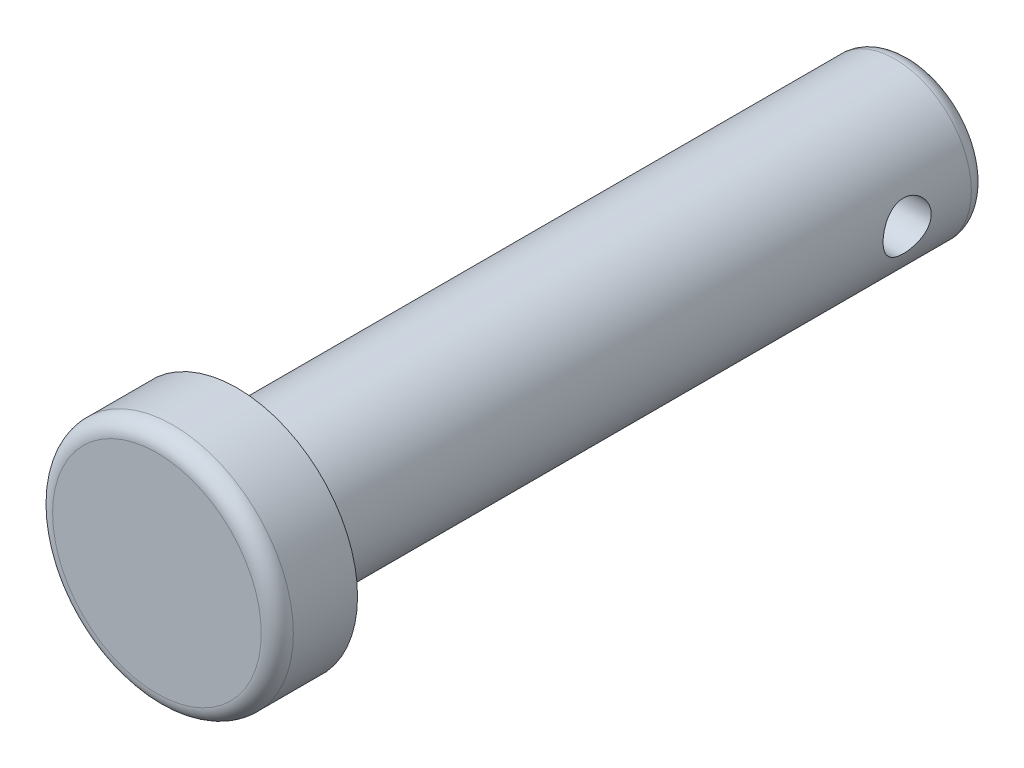
ISO-10303-21;
HEADER;
FILE_DESCRIPTION(('STEP AP214'),'2;1');
FILE_NAME('part.step','',(''),(''),'','','');
FILE_SCHEMA(('AUTOMOTIVE_DESIGN { 1 0 10303 214 1 1 1 1 }'));
ENDSEC;
DATA;
#1=APPLICATION_CONTEXT('core data for automotive mechanical design processes');
#2=APPLICATION_PROTOCOL_DEFINITION('international standard','automotive_design',2000,#1);
#3=PRODUCT_CONTEXT('',#1,'mechanical');
#4=PRODUCT('Part','Part','',(#3));
#5=PRODUCT_RELATED_PRODUCT_CATEGORY('part','',(#4));
#6=PRODUCT_DEFINITION_FORMATION('','',#4);
#7=PRODUCT_DEFINITION_CONTEXT('part definition',#1,'design');
#8=PRODUCT_DEFINITION('design','',#6,#7);
#9=PRODUCT_DEFINITION_SHAPE('','',#8);
#10=(LENGTH_UNIT() NAMED_UNIT(*) SI_UNIT(.MILLI.,.METRE.));
#11=(NAMED_UNIT(*) PLANE_ANGLE_UNIT() SI_UNIT($,.RADIAN.));
#12=(NAMED_UNIT(*) SI_UNIT($,.STERADIAN.) SOLID_ANGLE_UNIT());
#13=UNCERTAINTY_MEASURE_WITH_UNIT(LENGTH_MEASURE(1.E-05),#10,'distance_accuracy_value','');
#14=(GEOMETRIC_REPRESENTATION_CONTEXT(3) GLOBAL_UNCERTAINTY_ASSIGNED_CONTEXT((#13)) GLOBAL_UNIT_ASSIGNED_CONTEXT((#10,
#11,#12)) REPRESENTATION_CONTEXT('',''));
#15=CARTESIAN_POINT('',(0.,0.,0.));
#16=DIRECTION('',(0.,0.,1.));
#17=DIRECTION('',(1.,0.,0.));
#18=AXIS2_PLACEMENT_3D('',#15,#16,#17);
#19=CARTESIAN_POINT('',(0.,0.,0.));
#20=DIRECTION('',(0.,0.,1.));
#21=DIRECTION('',(1.,0.,0.));
#22=AXIS2_PLACEMENT_3D('',#19,#20,#21);
#23=CYLINDRICAL_SURFACE('',#22,4.75);
#24=CARTESIAN_POINT('',(0.,0.,0.));
#25=DIRECTION('',(0.,0.,1.));
#26=DIRECTION('',(1.,0.,0.));
#27=AXIS2_PLACEMENT_3D('',#24,#25,#26);
#28=CIRCLE('',#27,4.75);
#29=CARTESIAN_POINT('',(4.75,0.,0.));
#30=VERTEX_POINT('',#29);
#31=EDGE_CURVE('E70',#30,#30,#28,.T.);
#32=ORIENTED_EDGE('',*,*,#31,.F.);
#33=EDGE_LOOP('',(#32));
#34=FACE_BOUND('',#33,.T.);
#35=CARTESIAN_POINT('',(0.,0.,-41.));
#36=DIRECTION('',(0.,0.,-1.));
#37=DIRECTION('',(-1.,0.,0.));
#38=AXIS2_PLACEMENT_3D('',#35,#36,#37);
#39=CIRCLE('',#38,4.75);
#40=CARTESIAN_POINT('',(-4.75,0.,-41.));
#41=VERTEX_POINT('',#40);
#42=EDGE_CURVE('E55',#41,#41,#39,.F.);
#43=ORIENTED_EDGE('',*,*,#42,.T.);
#44=EDGE_LOOP('',(#43));
#45=FACE_BOUND('',#44,.T.);
#46=CARTESIAN_POINT('',(-4.75,0.,-35.5));
#47=CARTESIAN_POINT('',(-4.74999967904615,-0.0820835447314048,-35.5000004039971));
#48=CARTESIAN_POINT('',(-4.74785228936724,-0.164171496501828,-35.5067598694946));
#49=CARTESIAN_POINT('',(-4.73949648091444,-0.325944116631498,-35.5335464492232));
#50=CARTESIAN_POINT('',(-4.73328722070904,-0.405628283459123,-35.5535763124773));
#51=CARTESIAN_POINT('',(-4.71748543187023,-0.560237269504345,-35.606158956184));
#52=CARTESIAN_POINT('',(-4.7078982073406,-0.635169334090952,-35.638692111107));
#53=CARTESIAN_POINT('',(-4.68632862599565,-0.778514579207217,-35.7152735364287));
#54=CARTESIAN_POINT('',(-4.67434587655187,-0.846926688392997,-35.7593236948384));
#55=CARTESIAN_POINT('',(-4.64883376662147,-0.977443078754503,-35.8591473374264));
#56=CARTESIAN_POINT('',(-4.63527018347254,-1.03931346588883,-35.9152178487368));
#57=CARTESIAN_POINT('',(-4.60832176901776,-1.15294742613926,-36.0368582801228));
#58=CARTESIAN_POINT('',(-4.5949369723419,-1.2047090669501,-36.1024300122094));
#59=CARTESIAN_POINT('',(-4.56949296853185,-1.29793466853577,-36.2432487821159));
#60=CARTESIAN_POINT('',(-4.55747591989588,-1.33910462019172,-36.3186988034441));
#61=CARTESIAN_POINT('',(-4.53664362085522,-1.40807389327236,-36.4758924617762));
#62=CARTESIAN_POINT('',(-4.52782750686213,-1.43587682167781,-36.5576343940453));
#63=CARTESIAN_POINT('',(-4.51475360613692,-1.47646364106285,-36.7224489023695));
#64=CARTESIAN_POINT('',(-4.51036428133252,-1.48968210274354,-36.8054037344088));
#65=CARTESIAN_POINT('',(-4.50625061102434,-1.50208257395981,-36.9724608982199));
#66=CARTESIAN_POINT('',(-4.50652499510326,-1.50126840605207,-37.0565629112566));
#67=CARTESIAN_POINT('',(-4.51159176137022,-1.48596623804714,-37.2199155188389));
#68=CARTESIAN_POINT('',(-4.51620087396631,-1.47203288124122,-37.2992247162408));
#69=CARTESIAN_POINT('',(-4.52911970742075,-1.43178798005592,-37.4543165274426));
#70=CARTESIAN_POINT('',(-4.53742982916609,-1.40547509472982,-37.530098758225));
#71=CARTESIAN_POINT('',(-4.55695325959034,-1.34083084084603,-37.6772972678757));
#72=CARTESIAN_POINT('',(-4.56820783899944,-1.30232683858134,-37.7486320231548));
#73=CARTESIAN_POINT('',(-4.59233341866295,-1.21451321691615,-37.8840088243496));
#74=CARTESIAN_POINT('',(-4.60520484585311,-1.16520074091948,-37.9480489355345));
#75=CARTESIAN_POINT('',(-4.63184688202887,-1.05445721763047,-38.0701513614985));
#76=CARTESIAN_POINT('',(-4.64563145900086,-0.992568961591257,-38.1277967290741));
#77=CARTESIAN_POINT('',(-4.67201892608795,-0.859832533931193,-38.2319932402701));
#78=CARTESIAN_POINT('',(-4.68462172487032,-0.78898367078958,-38.2785435268444));
#79=CARTESIAN_POINT('',(-4.70736283385871,-0.639521244304238,-38.3595190444748));
#80=CARTESIAN_POINT('',(-4.71748034190943,-0.560849403229559,-38.3938429460244));
#81=CARTESIAN_POINT('',(-4.73396063106369,-0.398454273025003,-38.448644777802));
#82=CARTESIAN_POINT('',(-4.74032457733139,-0.314732560358455,-38.4691270049897));
#83=CARTESIAN_POINT('',(-4.74839235389519,-0.14815194200106,-38.4949494591391));
#84=CARTESIAN_POINT('',(-4.75026975398177,-0.0653887879529884,-38.5008539658023));
#85=CARTESIAN_POINT('',(-4.74966735792893,0.099955689480422,-38.4989468825836));
#86=CARTESIAN_POINT('',(-4.74718821327919,0.182537038204384,-38.491137343538));
#87=CARTESIAN_POINT('',(-4.73826543461407,0.342984606452107,-38.4624759101159));
#88=CARTESIAN_POINT('',(-4.73192442641254,0.420917353280696,-38.4419614087206));
#89=CARTESIAN_POINT('',(-4.71602217273613,0.572211571751274,-38.3888856268636));
#90=CARTESIAN_POINT('',(-4.70646052712339,0.645572474036249,-38.3563228494528));
#91=CARTESIAN_POINT('',(-4.68480447515659,0.787656381223488,-38.2791769099363));
#92=CARTESIAN_POINT('',(-4.67265334948307,0.856220098995372,-38.2343167429269));
#93=CARTESIAN_POINT('',(-4.64720609363859,0.985034898254592,-38.1341806788739));
#94=CARTESIAN_POINT('',(-4.63390964727142,1.04528367215737,-38.0789019004592));
#95=CARTESIAN_POINT('',(-4.60699149316922,1.15829337789972,-37.9568434032573));
#96=CARTESIAN_POINT('',(-4.593378435549,1.21065200367447,-37.8896884394285));
#97=CARTESIAN_POINT('',(-4.5679297313532,1.30339506663711,-37.7472499614566));
#98=CARTESIAN_POINT('',(-4.55609406225838,1.34377965554056,-37.6719665503204));
#99=CARTESIAN_POINT('',(-4.53566962908159,1.41118548758715,-37.5155380511194));
#100=CARTESIAN_POINT('',(-4.52706911631109,1.43825519702983,-37.4344154730757));
#101=CARTESIAN_POINT('',(-4.5141696846939,1.47824972090379,-37.2684351998774));
#102=CARTESIAN_POINT('',(-4.50986908404445,1.49118006577835,-37.1835789786119));
#103=CARTESIAN_POINT('',(-4.50623416787646,1.50212620605735,-37.0167530740698));
#104=CARTESIAN_POINT('',(-4.50667969384457,1.50080314084642,-36.9348310400016));
#105=CARTESIAN_POINT('',(-4.51195053556042,1.48488083195079,-36.7724383421137));
#106=CARTESIAN_POINT('',(-4.51677563881295,1.47028223238921,-36.6919676080709));
#107=CARTESIAN_POINT('',(-4.53010652438159,1.42866989928935,-36.5359715292175));
#108=CARTESIAN_POINT('',(-4.53855497041869,1.40184917312304,-36.4603894272117));
#109=CARTESIAN_POINT('',(-4.55816492249634,1.33670650315647,-36.3147380042112));
#110=CARTESIAN_POINT('',(-4.56932698861838,1.29838218467217,-36.2446698252275));
#111=CARTESIAN_POINT('',(-4.59366117792159,1.2095354013046,-36.1090132547025));
#112=CARTESIAN_POINT('',(-4.60689565835744,1.15858784628933,-36.0437144917316));
#113=CARTESIAN_POINT('',(-4.63360081206469,1.0466842406539,-35.9223791623693));
#114=CARTESIAN_POINT('',(-4.64707154816902,0.985725490335817,-35.8663451025729));
#115=CARTESIAN_POINT('',(-4.67327443028954,0.853066326423952,-35.7632430756949));
#116=CARTESIAN_POINT('',(-4.68596655437371,0.781073823515228,-35.7165396092703));
#117=CARTESIAN_POINT('',(-4.70867379243004,0.629859472842862,-35.635958315629));
#118=CARTESIAN_POINT('',(-4.71868990328235,0.550640331972045,-35.6020757103654));
#119=CARTESIAN_POINT('',(-4.7342664308075,0.393635914977816,-35.5504012308968));
#120=CARTESIAN_POINT('',(-4.74011460510933,0.316225133186438,-35.5315561204144));
#121=CARTESIAN_POINT('',(-4.7479811380776,0.159210635950566,-35.5063566373355));
#122=CARTESIAN_POINT('',(-4.75000031127187,0.0796073905560847,-35.49999960819));
#123=CARTESIAN_POINT('',(-4.75,0.,-35.5));
#124=B_SPLINE_CURVE_WITH_KNOTS('',3,(#46,#47,#48,#49,#50,#51,#52,#53,#54,#55,#56,#57,#58,#59,
#60,#61,#62,#63,#64,#65,#66,#67,#68,#69,#70,#71,#72,#73,#74,#75,#76,#77,#78,#79,#80,#81,#82,#83,
#84,#85,#86,#87,#88,#89,#90,#91,#92,#93,#94,#95,#96,#97,#98,#99,#100,#101,#102,#103,#104,#105,
#106,#107,#108,#109,#110,#111,#112,#113,#114,#115,#116,#117,#118,#119,#120,#121,#122,#123),
.UNSPECIFIED.,.T.,.F.,(4,2,2,2,2,2,2,2,2,2,2,2,2,2,2,2,2,2,2,2,2,2,2,2,2,2,2,2,2,2,2,2,2,2,2,2,
2,2,4),(0.,0.245957970852691,0.491966908951222,0.737591271008997,0.983255924152804,
1.23588716608585,1.4885666517754,1.74764569043263,2.00665477945945,2.25771831624515,
2.50871346318117,2.74955211816806,2.99041686673246,3.23485763830864,3.47936309176113,
3.73524847406481,3.99115361598384,4.24913282924923,4.50703191953742,4.75477968540459,
5.00249040554177,5.24388939060298,5.48531837858215,5.73270991189648,5.98016996447343,
6.23765665880274,6.49514009053909,6.75167921313647,7.00811795759371,7.25271509638718,
7.49730036806767,7.73815036093372,7.97905010664366,8.22954585775128,8.48010927077557,
8.73909121554316,8.99797654827697,9.23656564494835,9.47510398183576),.UNSPECIFIED.);
#125=CARTESIAN_POINT('',(-4.75,0.,-35.5));
#126=VERTEX_POINT('',#125);
#127=EDGE_CURVE('E64',#126,#126,#124,.T.);
#128=ORIENTED_EDGE('',*,*,#127,.T.);
#129=EDGE_LOOP('',(#128));
#130=FACE_BOUND('',#129,.T.);
#131=CARTESIAN_POINT('',(4.75,0.,-35.5));
#132=CARTESIAN_POINT('',(4.74999967904615,0.0820835447314048,-35.5000004039971));
#133=CARTESIAN_POINT('',(4.74785228936724,0.164171496501828,-35.5067598694946));
#134=CARTESIAN_POINT('',(4.73949648091444,0.325944116631498,-35.5335464492232));
#135=CARTESIAN_POINT('',(4.73328722070904,0.405628283459123,-35.5535763124773));
#136=CARTESIAN_POINT('',(4.71748543187023,0.560237269504345,-35.606158956184));
#137=CARTESIAN_POINT('',(4.7078982073406,0.635169334090952,-35.638692111107));
#138=CARTESIAN_POINT('',(4.68632862599565,0.778514579207217,-35.7152735364287));
#139=CARTESIAN_POINT('',(4.67434587655187,0.846926688392997,-35.7593236948384));
#140=CARTESIAN_POINT('',(4.64883376662147,0.977443078754503,-35.8591473374264));
#141=CARTESIAN_POINT('',(4.63527018347254,1.03931346588883,-35.9152178487368));
#142=CARTESIAN_POINT('',(4.60832176901776,1.15294742613926,-36.0368582801228));
#143=CARTESIAN_POINT('',(4.5949369723419,1.2047090669501,-36.1024300122094));
#144=CARTESIAN_POINT('',(4.56949296853185,1.29793466853577,-36.2432487821159));
#145=CARTESIAN_POINT('',(4.55747591989588,1.33910462019172,-36.3186988034441));
#146=CARTESIAN_POINT('',(4.53664362085522,1.40807389327236,-36.4758924617762));
#147=CARTESIAN_POINT('',(4.52782750686213,1.43587682167781,-36.5576343940453));
#148=CARTESIAN_POINT('',(4.51475360613692,1.47646364106285,-36.7224489023695));
#149=CARTESIAN_POINT('',(4.51036428133252,1.48968210274354,-36.8054037344088));
#150=CARTESIAN_POINT('',(4.50625061102434,1.50208257395981,-36.9724608982199));
#151=CARTESIAN_POINT('',(4.50652499510326,1.50126840605207,-37.0565629112566));
#152=CARTESIAN_POINT('',(4.51159176137022,1.48596623804714,-37.2199155188389));
#153=CARTESIAN_POINT('',(4.51620087396631,1.47203288124122,-37.2992247162408));
#154=CARTESIAN_POINT('',(4.52911970742075,1.43178798005592,-37.4543165274426));
#155=CARTESIAN_POINT('',(4.53742982916609,1.40547509472982,-37.530098758225));
#156=CARTESIAN_POINT('',(4.55695325959034,1.34083084084603,-37.6772972678757));
#157=CARTESIAN_POINT('',(4.56820783899944,1.30232683858134,-37.7486320231548));
#158=CARTESIAN_POINT('',(4.59233341866295,1.21451321691615,-37.8840088243496));
#159=CARTESIAN_POINT('',(4.60520484585311,1.16520074091948,-37.9480489355345));
#160=CARTESIAN_POINT('',(4.63184688202887,1.05445721763047,-38.0701513614985));
#161=CARTESIAN_POINT('',(4.64563145900086,0.992568961591257,-38.1277967290741));
#162=CARTESIAN_POINT('',(4.67201892608795,0.859832533931193,-38.2319932402701));
#163=CARTESIAN_POINT('',(4.68462172487032,0.78898367078958,-38.2785435268444));
#164=CARTESIAN_POINT('',(4.70736283385871,0.639521244304238,-38.3595190444748));
#165=CARTESIAN_POINT('',(4.71748034190943,0.560849403229559,-38.3938429460244));
#166=CARTESIAN_POINT('',(4.73396063106369,0.398454273025003,-38.448644777802));
#167=CARTESIAN_POINT('',(4.74032457733139,0.314732560358455,-38.4691270049897));
#168=CARTESIAN_POINT('',(4.74839235389519,0.14815194200106,-38.4949494591391));
#169=CARTESIAN_POINT('',(4.75026975398177,0.0653887879529884,-38.5008539658023));
#170=CARTESIAN_POINT('',(4.74966735792893,-0.099955689480422,-38.4989468825836));
#171=CARTESIAN_POINT('',(4.74718821327919,-0.182537038204384,-38.491137343538));
#172=CARTESIAN_POINT('',(4.73826543461407,-0.342984606452107,-38.4624759101159));
#173=CARTESIAN_POINT('',(4.73192442641254,-0.420917353280696,-38.4419614087206));
#174=CARTESIAN_POINT('',(4.71602217273613,-0.572211571751274,-38.3888856268636));
#175=CARTESIAN_POINT('',(4.70646052712339,-0.645572474036249,-38.3563228494528));
#176=CARTESIAN_POINT('',(4.68480447515659,-0.787656381223488,-38.2791769099363));
#177=CARTESIAN_POINT('',(4.67265334948307,-0.856220098995372,-38.2343167429269));
#178=CARTESIAN_POINT('',(4.64720609363859,-0.985034898254592,-38.1341806788739));
#179=CARTESIAN_POINT('',(4.63390964727142,-1.04528367215737,-38.0789019004592));
#180=CARTESIAN_POINT('',(4.60699149316922,-1.15829337789972,-37.9568434032573));
#181=CARTESIAN_POINT('',(4.593378435549,-1.21065200367447,-37.8896884394285));
#182=CARTESIAN_POINT('',(4.5679297313532,-1.30339506663711,-37.7472499614566));
#183=CARTESIAN_POINT('',(4.55609406225838,-1.34377965554056,-37.6719665503204));
#184=CARTESIAN_POINT('',(4.53566962908159,-1.41118548758715,-37.5155380511194));
#185=CARTESIAN_POINT('',(4.52706911631109,-1.43825519702983,-37.4344154730757));
#186=CARTESIAN_POINT('',(4.5141696846939,-1.47824972090379,-37.2684351998774));
#187=CARTESIAN_POINT('',(4.50986908404445,-1.49118006577835,-37.1835789786119));
#188=CARTESIAN_POINT('',(4.50623416787646,-1.50212620605735,-37.0167530740698));
#189=CARTESIAN_POINT('',(4.50667969384457,-1.50080314084642,-36.9348310400016));
#190=CARTESIAN_POINT('',(4.51195053556042,-1.48488083195079,-36.7724383421137));
#191=CARTESIAN_POINT('',(4.51677563881295,-1.47028223238921,-36.6919676080709));
#192=CARTESIAN_POINT('',(4.53010652438159,-1.42866989928935,-36.5359715292175));
#193=CARTESIAN_POINT('',(4.53855497041869,-1.40184917312304,-36.4603894272117));
#194=CARTESIAN_POINT('',(4.55816492249634,-1.33670650315647,-36.3147380042112));
#195=CARTESIAN_POINT('',(4.56932698861838,-1.29838218467217,-36.2446698252275));
#196=CARTESIAN_POINT('',(4.59366117792159,-1.2095354013046,-36.1090132547025));
#197=CARTESIAN_POINT('',(4.60689565835744,-1.15858784628933,-36.0437144917316));
#198=CARTESIAN_POINT('',(4.63360081206469,-1.0466842406539,-35.9223791623693));
#199=CARTESIAN_POINT('',(4.64707154816902,-0.985725490335817,-35.8663451025729));
#200=CARTESIAN_POINT('',(4.67327443028954,-0.853066326423952,-35.7632430756949));
#201=CARTESIAN_POINT('',(4.68596655437371,-0.781073823515228,-35.7165396092703));
#202=CARTESIAN_POINT('',(4.70867379243004,-0.629859472842862,-35.635958315629));
#203=CARTESIAN_POINT('',(4.71868990328235,-0.550640331972045,-35.6020757103654));
#204=CARTESIAN_POINT('',(4.7342664308075,-0.393635914977816,-35.5504012308968));
#205=CARTESIAN_POINT('',(4.74011460510933,-0.316225133186438,-35.5315561204144));
#206=CARTESIAN_POINT('',(4.7479811380776,-0.159210635950566,-35.5063566373355));
#207=CARTESIAN_POINT('',(4.75000031127187,-0.0796073905560847,-35.49999960819));
#208=CARTESIAN_POINT('',(4.75,0.,-35.5));
#209=B_SPLINE_CURVE_WITH_KNOTS('',3,(#131,#132,#133,#134,#135,#136,#137,#138,#139,#140,#141,
#142,#143,#144,#145,#146,#147,#148,#149,#150,#151,#152,#153,#154,#155,#156,#157,#158,#159,#160,
#161,#162,#163,#164,#165,#166,#167,#168,#169,#170,#171,#172,#173,#174,#175,#176,#177,#178,#179,
#180,#181,#182,#183,#184,#185,#186,#187,#188,#189,#190,#191,#192,#193,#194,#195,#196,#197,#198,
#199,#200,#201,#202,#203,#204,#205,#206,#207,#208),.UNSPECIFIED.,.T.,.F.,(4,2,2,2,2,2,2,2,2,2,2,
2,2,2,2,2,2,2,2,2,2,2,2,2,2,2,2,2,2,2,2,2,2,2,2,2,2,2,4),(0.,0.245957970852691,
0.491966908951222,0.737591271008997,0.983255924152804,1.23588716608585,1.4885666517754,
1.74764569043263,2.00665477945945,2.25771831624515,2.50871346318117,2.74955211816806,
2.99041686673246,3.23485763830864,3.47936309176113,3.73524847406481,3.99115361598384,
4.24913282924923,4.50703191953742,4.75477968540459,5.00249040554177,5.24388939060298,
5.48531837858215,5.73270991189648,5.98016996447343,6.23765665880274,6.49514009053909,
6.75167921313647,7.00811795759371,7.25271509638718,7.49730036806767,7.73815036093372,
7.97905010664366,8.22954585775128,8.48010927077557,8.73909121554316,8.99797654827697,
9.23656564494835,9.47510398183576),.UNSPECIFIED.);
#210=CARTESIAN_POINT('',(4.75,0.,-35.5));
#211=VERTEX_POINT('',#210);
#212=EDGE_CURVE('E10',#211,#211,#209,.T.);
#213=ORIENTED_EDGE('',*,*,#212,.T.);
#214=EDGE_LOOP('',(#213));
#215=FACE_BOUND('',#214,.T.);
#216=ADVANCED_FACE('F37',(#34,#45,#130,#215),#23,.T.);
#217=CARTESIAN_POINT('',(0.,0.,5.));
#218=DIRECTION('',(0.,0.,-1.));
#219=DIRECTION('',(-1.,0.,0.));
#220=AXIS2_PLACEMENT_3D('',#217,#218,#219);
#221=CYLINDRICAL_SURFACE('',#220,7.5);
#222=CARTESIAN_POINT('',(0.,0.,4.));
#223=DIRECTION('',(0.,0.,1.));
#224=DIRECTION('',(1.,0.,0.));
#225=AXIS2_PLACEMENT_3D('',#222,#223,#224);
#226=CIRCLE('',#225,7.5);
#227=CARTESIAN_POINT('',(7.5,0.,4.));
#228=VERTEX_POINT('',#227);
#229=EDGE_CURVE('E61',#228,#228,#226,.F.);
#230=ORIENTED_EDGE('',*,*,#229,.T.);
#231=EDGE_LOOP('',(#230));
#232=FACE_BOUND('',#231,.T.);
#233=CARTESIAN_POINT('',(0.,0.,0.));
#234=DIRECTION('',(0.,0.,1.));
#235=DIRECTION('',(1.,0.,0.));
#236=AXIS2_PLACEMENT_3D('',#233,#234,#235);
#237=CIRCLE('',#236,7.5);
#238=CARTESIAN_POINT('',(7.5,0.,0.));
#239=VERTEX_POINT('',#238);
#240=EDGE_CURVE('E108',#239,#239,#237,.T.);
#241=ORIENTED_EDGE('',*,*,#240,.T.);
#242=EDGE_LOOP('',(#241));
#243=FACE_BOUND('',#242,.T.);
#244=ADVANCED_FACE('F90',(#232,#243),#221,.T.);
#245=CARTESIAN_POINT('',(0.,0.,5.));
#246=DIRECTION('',(0.,0.,1.));
#247=DIRECTION('',(1.,0.,0.));
#248=AXIS2_PLACEMENT_3D('',#245,#246,#247);
#249=PLANE('',#248);
#250=CARTESIAN_POINT('',(0.,0.,5.));
#251=DIRECTION('',(0.,0.,1.));
#252=DIRECTION('',(1.,0.,0.));
#253=AXIS2_PLACEMENT_3D('',#250,#251,#252);
#254=CIRCLE('',#253,6.5);
#255=CARTESIAN_POINT('',(6.5,0.,5.));
#256=VERTEX_POINT('',#255);
#257=EDGE_CURVE('E112',#256,#256,#254,.T.);
#258=ORIENTED_EDGE('',*,*,#257,.T.);
#259=EDGE_LOOP('',(#258));
#260=FACE_BOUND('',#259,.T.);
#261=ADVANCED_FACE('F95',(#260),#249,.T.);
#262=CARTESIAN_POINT('',(0.,0.,0.));
#263=DIRECTION('',(0.,0.,1.));
#264=DIRECTION('',(1.,0.,0.));
#265=AXIS2_PLACEMENT_3D('',#262,#263,#264);
#266=PLANE('',#265);
#267=ORIENTED_EDGE('',*,*,#31,.T.);
#268=EDGE_LOOP('',(#267));
#269=FACE_BOUND('',#268,.T.);
#270=ORIENTED_EDGE('',*,*,#240,.F.);
#271=EDGE_LOOP('',(#270));
#272=FACE_BOUND('',#271,.T.);
#273=ADVANCED_FACE('F87',(#269,#272),#266,.F.);
#274=CARTESIAN_POINT('',(0.,0.,4.));
#275=DIRECTION('',(0.,0.,1.));
#276=DIRECTION('',(1.,0.,0.));
#277=AXIS2_PLACEMENT_3D('',#274,#275,#276);
#278=TOROIDAL_SURFACE('',#277,6.5,1.);
#279=ORIENTED_EDGE('',*,*,#229,.F.);
#280=EDGE_LOOP('',(#279));
#281=FACE_BOUND('',#280,.T.);
#282=ORIENTED_EDGE('',*,*,#257,.F.);
#283=EDGE_LOOP('',(#282));
#284=FACE_BOUND('',#283,.T.);
#285=ADVANCED_FACE('F81',(#281,#284),#278,.T.);
#286=CARTESIAN_POINT('',(0.,0.,-42.));
#287=DIRECTION('',(0.,0.,-1.));
#288=DIRECTION('',(-1.,0.,0.));
#289=AXIS2_PLACEMENT_3D('',#286,#287,#288);
#290=PLANE('',#289);
#291=CARTESIAN_POINT('',(0.,0.,-42.));
#292=DIRECTION('',(0.,0.,-1.));
#293=DIRECTION('',(-1.,0.,0.));
#294=AXIS2_PLACEMENT_3D('',#291,#292,#293);
#295=CIRCLE('',#294,3.75);
#296=CARTESIAN_POINT('',(-3.75,0.,-42.));
#297=VERTEX_POINT('',#296);
#298=EDGE_CURVE('E50',#297,#297,#295,.T.);
#299=ORIENTED_EDGE('',*,*,#298,.T.);
#300=EDGE_LOOP('',(#299));
#301=FACE_BOUND('',#300,.T.);
#302=ADVANCED_FACE('F78',(#301),#290,.T.);
#303=CARTESIAN_POINT('',(0.,0.,-41.));
#304=DIRECTION('',(0.,0.,-1.));
#305=DIRECTION('',(-1.,0.,0.));
#306=AXIS2_PLACEMENT_3D('',#303,#304,#305);
#307=TOROIDAL_SURFACE('',#306,3.75,1.);
#308=ORIENTED_EDGE('',*,*,#298,.F.);
#309=EDGE_LOOP('',(#308));
#310=FACE_BOUND('',#309,.T.);
#311=ORIENTED_EDGE('',*,*,#42,.F.);
#312=EDGE_LOOP('',(#311));
#313=FACE_BOUND('',#312,.T.);
#314=ADVANCED_FACE('F39',(#310,#313),#307,.T.);
#315=CARTESIAN_POINT('',(0.,0.,-37.));
#316=DIRECTION('',(-1.,0.,0.));
#317=DIRECTION('',(0.,0.,1.));
#318=AXIS2_PLACEMENT_3D('',#315,#316,#317);
#319=CYLINDRICAL_SURFACE('',#318,1.5);
#320=ORIENTED_EDGE('',*,*,#127,.F.);
#321=EDGE_LOOP('',(#320));
#322=FACE_BOUND('',#321,.T.);
#323=ORIENTED_EDGE('',*,*,#212,.F.);
#324=EDGE_LOOP('',(#323));
#325=FACE_BOUND('',#324,.T.);
#326=ADVANCED_FACE('F74',(#322,#325),#319,.F.);
#327=CLOSED_SHELL('',(#216,#244,#261,#273,#285,#302,#314,#326));
#328=MANIFOLD_SOLID_BREP('B2',#327);
#329=ADVANCED_BREP_SHAPE_REPRESENTATION('',(#18,#328),#14);
#330=SHAPE_DEFINITION_REPRESENTATION(#9,#329);
ENDSEC;
END-ISO-10303-21;
